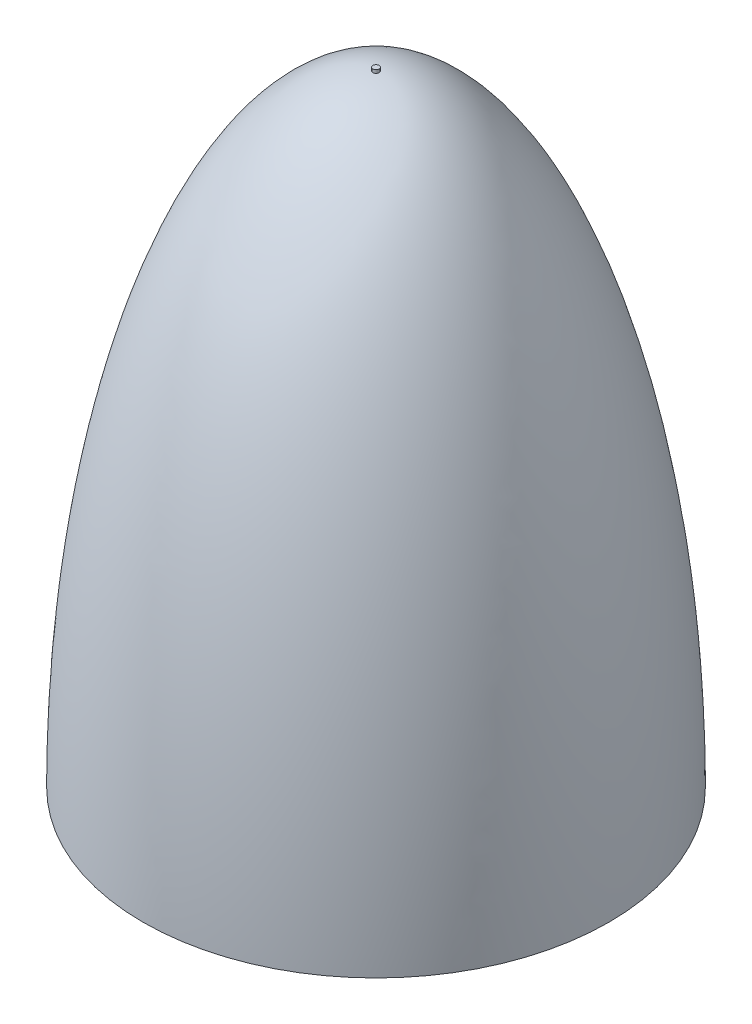
ISO-10303-21;
HEADER;
FILE_DESCRIPTION(('STEP AP214'),'2;1');
FILE_NAME('part.step','',(''),(''),'','','');
FILE_SCHEMA(('AUTOMOTIVE_DESIGN { 1 0 10303 214 1 1 1 1 }'));
ENDSEC;
DATA;
#1=APPLICATION_CONTEXT('core data for automotive mechanical design processes');
#2=APPLICATION_PROTOCOL_DEFINITION('international standard','automotive_design',2000,#1);
#3=PRODUCT_CONTEXT('',#1,'mechanical');
#4=PRODUCT('Part','Part','',(#3));
#5=PRODUCT_RELATED_PRODUCT_CATEGORY('part','',(#4));
#6=PRODUCT_DEFINITION_FORMATION('','',#4);
#7=PRODUCT_DEFINITION_CONTEXT('part definition',#1,'design');
#8=PRODUCT_DEFINITION('design','',#6,#7);
#9=PRODUCT_DEFINITION_SHAPE('','',#8);
#10=(LENGTH_UNIT() NAMED_UNIT(*) SI_UNIT(.MILLI.,.METRE.));
#11=(NAMED_UNIT(*) PLANE_ANGLE_UNIT() SI_UNIT($,.RADIAN.));
#12=(NAMED_UNIT(*) SI_UNIT($,.STERADIAN.) SOLID_ANGLE_UNIT());
#13=UNCERTAINTY_MEASURE_WITH_UNIT(LENGTH_MEASURE(1.E-05),#10,'distance_accuracy_value','');
#14=(GEOMETRIC_REPRESENTATION_CONTEXT(3) GLOBAL_UNCERTAINTY_ASSIGNED_CONTEXT((#13)) GLOBAL_UNIT_ASSIGNED_CONTEXT((#10,
#11,#12)) REPRESENTATION_CONTEXT('',''));
#15=CARTESIAN_POINT('',(0.,0.,0.));
#16=DIRECTION('',(0.,0.,1.));
#17=DIRECTION('',(1.,0.,0.));
#18=AXIS2_PLACEMENT_3D('',#15,#16,#17);
#19=CARTESIAN_POINT('',(3.5527136788005E-12,-799.999999999996,-1.33226762955019E-12));
#20=DIRECTION('',(0.,-0.999999999999999,0.));
#21=DIRECTION('',(0.,0.,-0.999999999999995));
#22=AXIS2_PLACEMENT_3D('',#19,#20,#21);
#23=CONICAL_SURFACE('',#22,300.,0.358770670270572);
#24=CARTESIAN_POINT('',(0.,0.,0.));
#25=VERTEX_POINT('',#24);
#26=VERTEX_LOOP('',#25);
#27=FACE_BOUND('',#26,.T.);
#28=CARTESIAN_POINT('',(3.5527136788005E-12,-799.999999999996,-1.33226762955019E-12));
#29=DIRECTION('',(0.,0.999999999999999,0.));
#30=DIRECTION('',(0.,0.,0.999999999999995));
#31=AXIS2_PLACEMENT_3D('',#28,#29,#30);
#32=CIRCLE('',#31,300.);
#33=CARTESIAN_POINT('',(3.38618022510673E-12,-799.999999999996,299.999999999997));
#34=VERTEX_POINT('',#33);
#35=EDGE_CURVE('E11',#34,#34,#32,.T.);
#36=ORIENTED_EDGE('',*,*,#35,.F.);
#37=EDGE_LOOP('',(#36));
#38=FACE_BOUND('',#37,.T.);
#39=ADVANCED_FACE('F34',(#27,#38),#23,.F.);
#40=CARTESIAN_POINT('',(3.5527136788005E-12,-799.999999999996,-1.33226762955019E-12));
#41=DIRECTION('',(0.,0.,0.999999999999995));
#42=DIRECTION('',(0.,0.999999999999999,0.));
#43=AXIS2_PLACEMENT_3D('',#40,#41,#42);
#44=ELLIPSE('',#43,800.,300.);
#45=TRIMMED_CURVE('',#44,(PARAMETER_VALUE(3.14159265358979)),
(PARAMETER_VALUE(6.28318530717959)),.T.,.PARAMETER.);
#46=CARTESIAN_POINT('',(0.,0.,0.));
#47=DIRECTION('',(0.,0.999999999999999,0.));
#48=AXIS1_PLACEMENT('',#46,#47);
#49=SURFACE_OF_REVOLUTION('',#45,#48);
#50=CARTESIAN_POINT('',(7.105427357601E-12,-0.0711142718841096,-3.99680288865056E-12));
#51=DIRECTION('',(0.,0.999999999999999,0.));
#52=DIRECTION('',(0.,0.,0.999999999999995));
#53=AXIS2_PLACEMENT_3D('',#50,#51,#52);
#54=CIRCLE('',#53,3.99999999999929);
#55=CARTESIAN_POINT('',(0.,-0.0711142718841069,3.99999999999962));
#56=VERTEX_POINT('',#55);
#57=EDGE_CURVE('E40',#56,#56,#54,.T.);
#58=ORIENTED_EDGE('',*,*,#57,.F.);
#59=EDGE_LOOP('',(#58));
#60=FACE_BOUND('',#59,.T.);
#61=ORIENTED_EDGE('',*,*,#35,.T.);
#62=EDGE_LOOP('',(#61));
#63=FACE_BOUND('',#62,.T.);
#64=ADVANCED_FACE('F45',(#60,#63),#49,.T.);
#65=CARTESIAN_POINT('',(0.,0.,0.));
#66=DIRECTION('',(0.,0.999999999999999,0.));
#67=DIRECTION('',(0.,0.,0.999999999999995));
#68=AXIS2_PLACEMENT_3D('',#65,#66,#67);
#69=CYLINDRICAL_SURFACE('',#68,3.99999999999964);
#70=CARTESIAN_POINT('',(1.77635683940025E-12,4.00000000000311,-3.99680288865056E-12));
#71=DIRECTION('',(0.,0.999999999999999,0.));
#72=DIRECTION('',(0.,0.,0.999999999999995));
#73=AXIS2_PLACEMENT_3D('',#70,#71,#72);
#74=CIRCLE('',#73,4.);
#75=CARTESIAN_POINT('',(0.,4.00000000000311,3.99999999999962));
#76=VERTEX_POINT('',#75);
#77=EDGE_CURVE('E62',#76,#76,#74,.T.);
#78=CARTESIAN_POINT('',(0.,-0.0711142718841069,3.99999999999962));
#79=CARTESIAN_POINT('',(0.,-0.0287068315519483,3.99999999999962));
#80=CARTESIAN_POINT('',(0.,0.0137006087802102,3.99999999999962));
#81=CARTESIAN_POINT('',(0.,0.0985154894445273,3.99999999999962));
#82=CARTESIAN_POINT('',(0.,0.140922929776686,3.99999999999962));
#83=CARTESIAN_POINT('',(0.,0.225737810441003,3.99999999999962));
#84=CARTESIAN_POINT('',(0.,0.268145250773162,3.99999999999962));
#85=CARTESIAN_POINT('',(0.,0.352960131437479,3.99999999999962));
#86=CARTESIAN_POINT('',(0.,0.395367571769637,3.99999999999962));
#87=CARTESIAN_POINT('',(0.,0.480182452433954,3.99999999999962));
#88=CARTESIAN_POINT('',(0.,0.522589892766113,3.99999999999962));
#89=CARTESIAN_POINT('',(0.,0.60740477343043,3.99999999999962));
#90=CARTESIAN_POINT('',(0.,0.649812213762589,3.99999999999962));
#91=CARTESIAN_POINT('',(0.,0.734627094426906,3.99999999999962));
#92=CARTESIAN_POINT('',(0.,0.777034534759064,3.99999999999962));
#93=CARTESIAN_POINT('',(0.,0.861849415423381,3.99999999999962));
#94=CARTESIAN_POINT('',(0.,0.90425685575554,3.99999999999962));
#95=CARTESIAN_POINT('',(0.,0.989071736419857,3.99999999999962));
#96=CARTESIAN_POINT('',(0.,1.03147917675202,3.99999999999962));
#97=CARTESIAN_POINT('',(0.,1.11629405741633,3.99999999999962));
#98=CARTESIAN_POINT('',(0.,1.15870149774849,3.99999999999962));
#99=CARTESIAN_POINT('',(0.,1.24351637841281,3.99999999999962));
#100=CARTESIAN_POINT('',(0.,1.28592381874497,3.99999999999962));
#101=CARTESIAN_POINT('',(0.,1.37073869940928,3.99999999999962));
#102=CARTESIAN_POINT('',(0.,1.41314613974144,3.99999999999962));
#103=CARTESIAN_POINT('',(0.,1.49796102040576,3.99999999999962));
#104=CARTESIAN_POINT('',(0.,1.54036846073792,3.99999999999962));
#105=CARTESIAN_POINT('',(0.,1.62518334140224,3.99999999999962));
#106=CARTESIAN_POINT('',(0.,1.66759078173439,3.99999999999962));
#107=CARTESIAN_POINT('',(0.,1.75240566239871,3.99999999999962));
#108=CARTESIAN_POINT('',(0.,1.79481310273087,3.99999999999962));
#109=CARTESIAN_POINT('',(0.,1.87962798339519,3.99999999999962));
#110=CARTESIAN_POINT('',(0.,1.92203542372735,3.99999999999962));
#111=CARTESIAN_POINT('',(0.,2.00685030439166,3.99999999999962));
#112=CARTESIAN_POINT('',(0.,2.04925774472382,3.99999999999962));
#113=CARTESIAN_POINT('',(0.,2.13407262538814,3.99999999999962));
#114=CARTESIAN_POINT('',(0.,2.1764800657203,3.99999999999962));
#115=CARTESIAN_POINT('',(0.,2.26129494638462,3.99999999999962));
#116=CARTESIAN_POINT('',(0.,2.30370238671677,3.99999999999962));
#117=CARTESIAN_POINT('',(0.,2.38851726738109,3.99999999999962));
#118=CARTESIAN_POINT('',(0.,2.43092470771325,3.99999999999962));
#119=CARTESIAN_POINT('',(0.,2.51573958837757,3.99999999999962));
#120=CARTESIAN_POINT('',(0.,2.55814702870972,3.99999999999962));
#121=CARTESIAN_POINT('',(0.,2.64296190937404,3.99999999999962));
#122=CARTESIAN_POINT('',(0.,2.6853693497062,3.99999999999962));
#123=CARTESIAN_POINT('',(0.,2.77018423037052,3.99999999999962));
#124=CARTESIAN_POINT('',(0.,2.81259167070268,3.99999999999962));
#125=CARTESIAN_POINT('',(0.,2.89740655136699,3.99999999999962));
#126=CARTESIAN_POINT('',(0.,2.93981399169915,3.99999999999962));
#127=CARTESIAN_POINT('',(0.,3.02462887236347,3.99999999999962));
#128=CARTESIAN_POINT('',(0.,3.06703631269563,3.99999999999962));
#129=CARTESIAN_POINT('',(0.,3.15185119335994,3.99999999999962));
#130=CARTESIAN_POINT('',(0.,3.1942586336921,3.99999999999962));
#131=CARTESIAN_POINT('',(0.,3.27907351435642,3.99999999999962));
#132=CARTESIAN_POINT('',(0.,3.32148095468858,3.99999999999962));
#133=CARTESIAN_POINT('',(0.,3.4062958353529,3.99999999999962));
#134=CARTESIAN_POINT('',(0.,3.44870327568505,3.99999999999962));
#135=CARTESIAN_POINT('',(0.,3.53351815634937,3.99999999999962));
#136=CARTESIAN_POINT('',(0.,3.57592559668153,3.99999999999962));
#137=CARTESIAN_POINT('',(0.,3.66074047734585,3.99999999999962));
#138=CARTESIAN_POINT('',(0.,3.70314791767801,3.99999999999962));
#139=CARTESIAN_POINT('',(0.,3.78796279834232,3.99999999999962));
#140=CARTESIAN_POINT('',(0.,3.83037023867448,3.99999999999962));
#141=CARTESIAN_POINT('',(0.,3.9151851193388,3.99999999999962));
#142=CARTESIAN_POINT('',(0.,3.95759255967096,3.99999999999962));
#143=CARTESIAN_POINT('',(0.,4.00000000000311,3.99999999999962));
#144=B_SPLINE_CURVE_WITH_KNOTS('',3,(#78,#79,#80,#81,#82,#83,#84,#85,#86,#87,#88,#89,#90,#91,
#92,#93,#94,#95,#96,#97,#98,#99,#100,#101,#102,#103,#104,#105,#106,#107,#108,#109,#110,#111,
#112,#113,#114,#115,#116,#117,#118,#119,#120,#121,#122,#123,#124,#125,#126,#127,#128,#129,#130,
#131,#132,#133,#134,#135,#136,#137,#138,#139,#140,#141,#142,#143),.UNSPECIFIED.,.F.,.F.,(4,2,2,
2,2,2,2,2,2,2,2,2,2,2,2,2,2,2,2,2,2,2,2,2,2,2,2,2,2,2,2,2,4),(0.,0.127222320996476,
0.254444641992951,0.381666962989427,0.508889283985903,0.636111604982378,0.763333925978854,
0.89055624697533,1.01777856797181,1.14500088896828,1.27222320996476,1.39944553096123,
1.52666785195771,1.65389017295418,1.78111249395066,1.90833481494714,2.03555713594361,
2.16277945694009,2.29000177793656,2.41722409893304,2.54444641992951,2.67166874092599,
2.79889106192247,2.92611338291894,3.05333570391542,3.18055802491189,3.30778034590837,
3.43500266690484,3.56222498790132,3.6894473088978,3.81666962989427,3.94389195089075,
4.07111427188722),.UNSPECIFIED.);
#145=EDGE_CURVE('BSEAM49',#56,#76,#144,.T.);
#146=ORIENTED_EDGE('',*,*,#57,.T.);
#147=ORIENTED_EDGE('',*,*,#77,.F.);
#148=ORIENTED_EDGE('',*,*,#145,.T.);
#149=ORIENTED_EDGE('',*,*,#145,.F.);
#150=EDGE_LOOP('',(#146,#148,#147,#149));
#151=FACE_BOUND('',#150,.T.);
#152=ADVANCED_FACE('F49',(#151),#69,.T.);
#153=CARTESIAN_POINT('',(1.77635683940025E-12,4.00000000000311,-3.99680288865056E-12));
#154=DIRECTION('',(0.,0.999999999999999,0.));
#155=DIRECTION('',(0.,0.,0.999999999999995));
#156=AXIS2_PLACEMENT_3D('',#153,#154,#155);
#157=PLANE('',#156);
#158=ORIENTED_EDGE('',*,*,#77,.T.);
#159=EDGE_LOOP('',(#158));
#160=FACE_BOUND('',#159,.T.);
#161=ADVANCED_FACE('F54',(#160),#157,.T.);
#162=CLOSED_SHELL('',(#39,#64,#152,#161));
#163=MANIFOLD_SOLID_BREP('B2',#162);
#164=ADVANCED_BREP_SHAPE_REPRESENTATION('',(#18,#163),#14);
#165=SHAPE_DEFINITION_REPRESENTATION(#9,#164);
ENDSEC;
END-ISO-10303-21;
